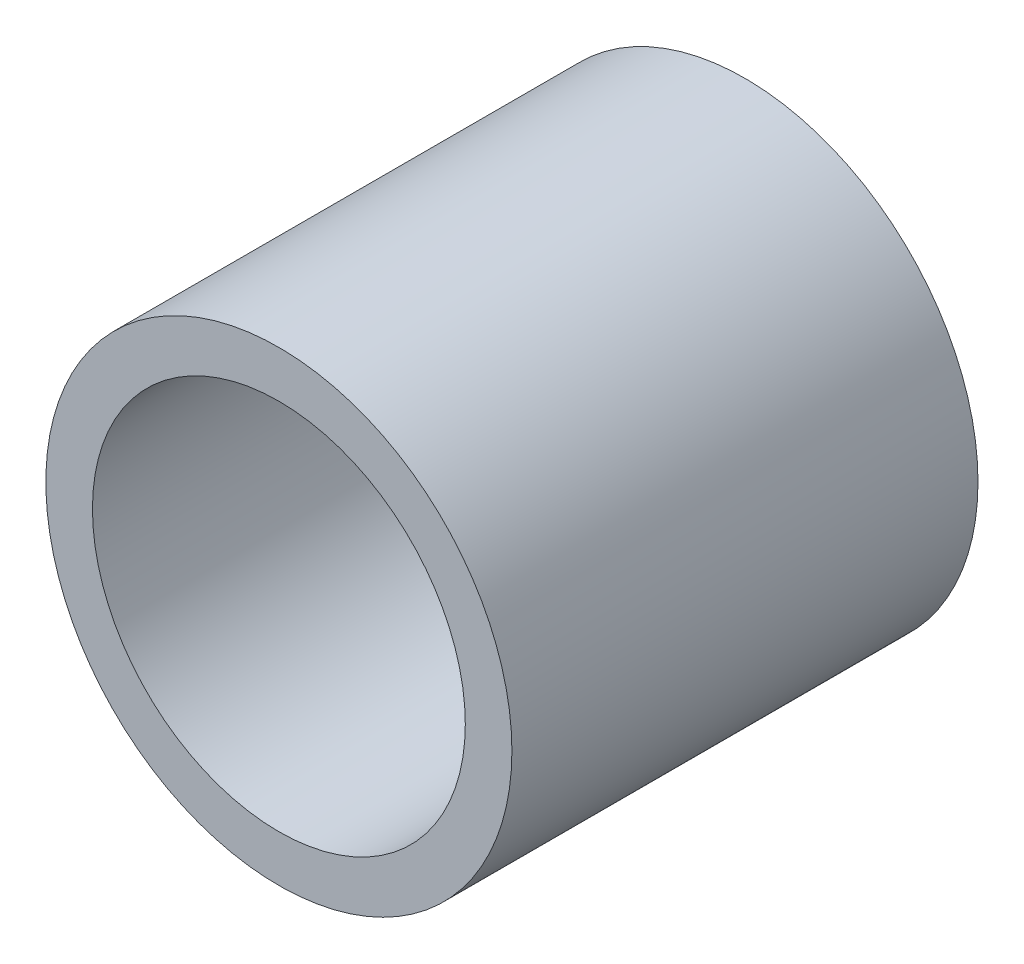
ISO-10303-21;
HEADER;
FILE_DESCRIPTION(('STEP AP214'),'2;1');
FILE_NAME('part.step','',(''),(''),'','','');
FILE_SCHEMA(('AUTOMOTIVE_DESIGN { 1 0 10303 214 1 1 1 1 }'));
ENDSEC;
DATA;
#1=APPLICATION_CONTEXT('core data for automotive mechanical design processes');
#2=APPLICATION_PROTOCOL_DEFINITION('international standard','automotive_design',2000,#1);
#3=PRODUCT_CONTEXT('',#1,'mechanical');
#4=PRODUCT('Part','Part','',(#3));
#5=PRODUCT_RELATED_PRODUCT_CATEGORY('part','',(#4));
#6=PRODUCT_DEFINITION_FORMATION('','',#4);
#7=PRODUCT_DEFINITION_CONTEXT('part definition',#1,'design');
#8=PRODUCT_DEFINITION('design','',#6,#7);
#9=PRODUCT_DEFINITION_SHAPE('','',#8);
#10=(LENGTH_UNIT() NAMED_UNIT(*) SI_UNIT(.MILLI.,.METRE.));
#11=(NAMED_UNIT(*) PLANE_ANGLE_UNIT() SI_UNIT($,.RADIAN.));
#12=(NAMED_UNIT(*) SI_UNIT($,.STERADIAN.) SOLID_ANGLE_UNIT());
#13=UNCERTAINTY_MEASURE_WITH_UNIT(LENGTH_MEASURE(1.E-05),#10,'distance_accuracy_value','');
#14=(GEOMETRIC_REPRESENTATION_CONTEXT(3) GLOBAL_UNCERTAINTY_ASSIGNED_CONTEXT((#13)) GLOBAL_UNIT_ASSIGNED_CONTEXT((#10,
#11,#12)) REPRESENTATION_CONTEXT('',''));
#15=CARTESIAN_POINT('',(0.,0.,0.));
#16=DIRECTION('',(0.,0.,1.));
#17=DIRECTION('',(1.,0.,0.));
#18=AXIS2_PLACEMENT_3D('',#15,#16,#17);
#19=CARTESIAN_POINT('',(0.,0.,7.9375));
#20=DIRECTION('',(0.,0.,1.));
#21=DIRECTION('',(1.,0.,0.));
#22=AXIS2_PLACEMENT_3D('',#19,#20,#21);
#23=PLANE('',#22);
#24=CARTESIAN_POINT('',(0.,0.,7.9375));
#25=DIRECTION('',(0.,0.,1.));
#26=DIRECTION('',(1.,0.,0.));
#27=AXIS2_PLACEMENT_3D('',#24,#25,#26);
#28=CIRCLE('',#27,7.9375);
#29=CARTESIAN_POINT('',(7.9375,0.,7.9375));
#30=VERTEX_POINT('',#29);
#31=EDGE_CURVE('E10',#30,#30,#28,.T.);
#32=ORIENTED_EDGE('',*,*,#31,.T.);
#33=EDGE_LOOP('',(#32));
#34=FACE_BOUND('',#33,.T.);
#35=CARTESIAN_POINT('',(0.,0.,7.9375));
#36=DIRECTION('',(0.,0.,1.));
#37=DIRECTION('',(1.,0.,0.));
#38=AXIS2_PLACEMENT_3D('',#35,#36,#37);
#39=CIRCLE('',#38,6.35);
#40=CARTESIAN_POINT('',(6.35,0.,7.9375));
#41=VERTEX_POINT('',#40);
#42=EDGE_CURVE('E42',#41,#41,#39,.T.);
#43=ORIENTED_EDGE('',*,*,#42,.F.);
#44=EDGE_LOOP('',(#43));
#45=FACE_BOUND('',#44,.T.);
#46=ADVANCED_FACE('F31',(#34,#45),#23,.T.);
#47=CARTESIAN_POINT('',(0.,0.,-7.9375));
#48=DIRECTION('',(0.,0.,1.));
#49=DIRECTION('',(1.,0.,0.));
#50=AXIS2_PLACEMENT_3D('',#47,#48,#49);
#51=PLANE('',#50);
#52=CARTESIAN_POINT('',(0.,0.,-7.9375));
#53=DIRECTION('',(0.,0.,1.));
#54=DIRECTION('',(1.,0.,0.));
#55=AXIS2_PLACEMENT_3D('',#52,#53,#54);
#56=CIRCLE('',#55,7.9375);
#57=CARTESIAN_POINT('',(7.9375,0.,-7.9375));
#58=VERTEX_POINT('',#57);
#59=EDGE_CURVE('E35',#58,#58,#56,.T.);
#60=ORIENTED_EDGE('',*,*,#59,.F.);
#61=EDGE_LOOP('',(#60));
#62=FACE_BOUND('',#61,.T.);
#63=CARTESIAN_POINT('',(0.,0.,-7.9375));
#64=DIRECTION('',(0.,0.,1.));
#65=DIRECTION('',(1.,0.,0.));
#66=AXIS2_PLACEMENT_3D('',#63,#64,#65);
#67=CIRCLE('',#66,6.35);
#68=CARTESIAN_POINT('',(6.35,0.,-7.9375));
#69=VERTEX_POINT('',#68);
#70=EDGE_CURVE('E44',#69,#69,#67,.T.);
#71=ORIENTED_EDGE('',*,*,#70,.T.);
#72=EDGE_LOOP('',(#71));
#73=FACE_BOUND('',#72,.T.);
#74=ADVANCED_FACE('F54',(#62,#73),#51,.F.);
#75=CARTESIAN_POINT('',(0.,0.,7.9375));
#76=DIRECTION('',(0.,0.,-1.));
#77=DIRECTION('',(-1.,0.,0.));
#78=AXIS2_PLACEMENT_3D('',#75,#76,#77);
#79=CYLINDRICAL_SURFACE('',#78,7.9375);
#80=ORIENTED_EDGE('',*,*,#31,.F.);
#81=EDGE_LOOP('',(#80));
#82=FACE_BOUND('',#81,.T.);
#83=ORIENTED_EDGE('',*,*,#59,.T.);
#84=EDGE_LOOP('',(#83));
#85=FACE_BOUND('',#84,.T.);
#86=ADVANCED_FACE('F33',(#82,#85),#79,.T.);
#87=CARTESIAN_POINT('',(0.,0.,7.9375));
#88=DIRECTION('',(0.,0.,-1.));
#89=DIRECTION('',(-1.,0.,0.));
#90=AXIS2_PLACEMENT_3D('',#87,#88,#89);
#91=CYLINDRICAL_SURFACE('',#90,6.35);
#92=ORIENTED_EDGE('',*,*,#42,.T.);
#93=EDGE_LOOP('',(#92));
#94=FACE_BOUND('',#93,.T.);
#95=ORIENTED_EDGE('',*,*,#70,.F.);
#96=EDGE_LOOP('',(#95));
#97=FACE_BOUND('',#96,.T.);
#98=ADVANCED_FACE('F50',(#94,#97),#91,.F.);
#99=CLOSED_SHELL('',(#46,#74,#86,#98));
#100=MANIFOLD_SOLID_BREP('B2',#99);
#101=ADVANCED_BREP_SHAPE_REPRESENTATION('',(#18,#100),#14);
#102=SHAPE_DEFINITION_REPRESENTATION(#9,#101);
ENDSEC;
END-ISO-10303-21;
